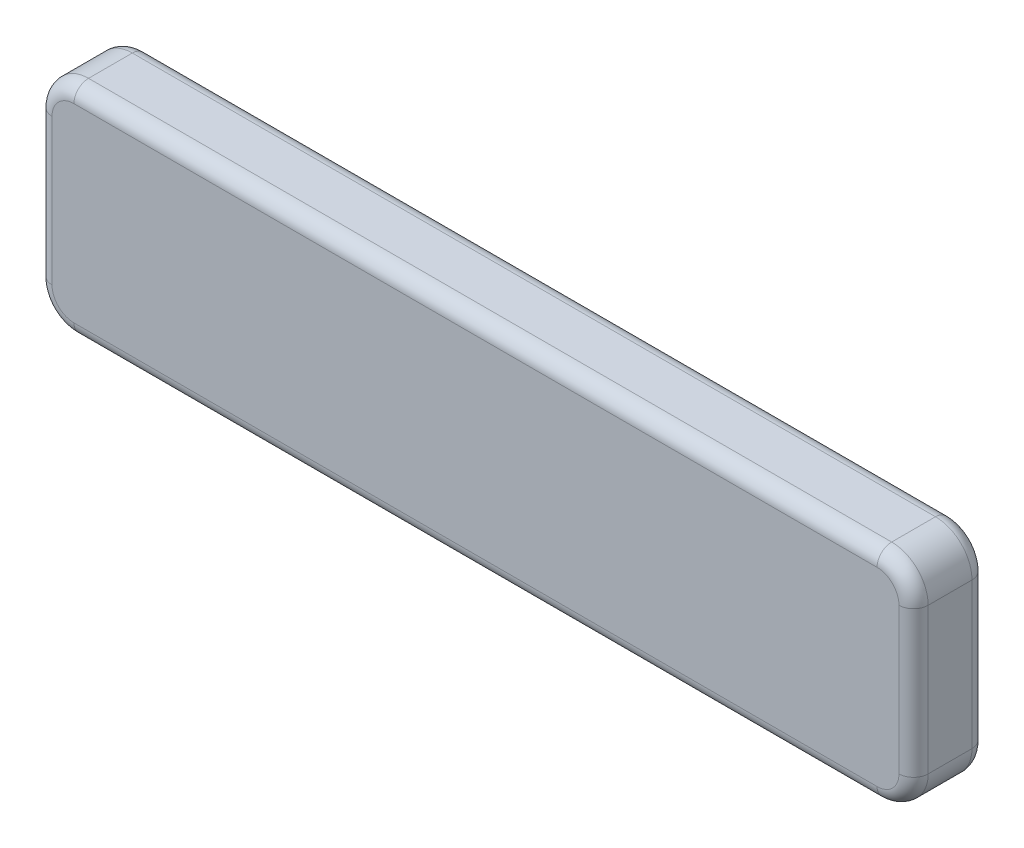
ISO-10303-21;
HEADER;
FILE_DESCRIPTION(('STEP AP214'),'2;1');
FILE_NAME('part.step','',(''),(''),'','','');
FILE_SCHEMA(('AUTOMOTIVE_DESIGN { 1 0 10303 214 1 1 1 1 }'));
ENDSEC;
DATA;
#1=APPLICATION_CONTEXT('core data for automotive mechanical design processes');
#2=APPLICATION_PROTOCOL_DEFINITION('international standard','automotive_design',2000,#1);
#3=PRODUCT_CONTEXT('',#1,'mechanical');
#4=PRODUCT('Part','Part','',(#3));
#5=PRODUCT_RELATED_PRODUCT_CATEGORY('part','',(#4));
#6=PRODUCT_DEFINITION_FORMATION('','',#4);
#7=PRODUCT_DEFINITION_CONTEXT('part definition',#1,'design');
#8=PRODUCT_DEFINITION('design','',#6,#7);
#9=PRODUCT_DEFINITION_SHAPE('','',#8);
#10=(LENGTH_UNIT() NAMED_UNIT(*) SI_UNIT(.MILLI.,.METRE.));
#11=(NAMED_UNIT(*) PLANE_ANGLE_UNIT() SI_UNIT($,.RADIAN.));
#12=(NAMED_UNIT(*) SI_UNIT($,.STERADIAN.) SOLID_ANGLE_UNIT());
#13=UNCERTAINTY_MEASURE_WITH_UNIT(LENGTH_MEASURE(1.E-05),#10,'distance_accuracy_value','');
#14=(GEOMETRIC_REPRESENTATION_CONTEXT(3) GLOBAL_UNCERTAINTY_ASSIGNED_CONTEXT((#13)) GLOBAL_UNIT_ASSIGNED_CONTEXT((#10,
#11,#12)) REPRESENTATION_CONTEXT('',''));
#15=CARTESIAN_POINT('',(0.,0.,0.));
#16=DIRECTION('',(0.,0.,1.));
#17=DIRECTION('',(1.,0.,0.));
#18=AXIS2_PLACEMENT_3D('',#15,#16,#17);
#19=CARTESIAN_POINT('',(-60.,-15.,10.));
#20=DIRECTION('',(1.,0.,0.));
#21=DIRECTION('',(0.,0.,-1.));
#22=AXIS2_PLACEMENT_3D('',#19,#20,#21);
#23=PLANE('',#22);
#24=DIRECTION('',(0.,0.,-1.));
#25=VECTOR('',#24,1.);
#26=CARTESIAN_POINT('',(-60.,9.99999999999998,10.));
#27=LINE('',#26,#25);
#28=CARTESIAN_POINT('',(-60.,9.99999999999998,8.));
#29=VERTEX_POINT('',#28);
#30=CARTESIAN_POINT('',(-60.,9.99999999999998,2.));
#31=VERTEX_POINT('',#30);
#32=EDGE_CURVE('E336',#29,#31,#27,.T.);
#33=ORIENTED_EDGE('',*,*,#32,.T.);
#34=DIRECTION('',(0.,-1.,0.));
#35=VECTOR('',#34,1.);
#36=CARTESIAN_POINT('',(-60.,-15.,2.));
#37=LINE('',#36,#35);
#38=CARTESIAN_POINT('',(-60.,-10.,2.));
#39=VERTEX_POINT('',#38);
#40=EDGE_CURVE('E223',#31,#39,#37,.T.);
#41=ORIENTED_EDGE('',*,*,#40,.T.);
#42=DIRECTION('',(0.,0.,-1.));
#43=VECTOR('',#42,1.);
#44=CARTESIAN_POINT('',(-60.,-10.,10.));
#45=LINE('',#44,#43);
#46=CARTESIAN_POINT('',(-60.,-10.,8.));
#47=VERTEX_POINT('',#46);
#48=EDGE_CURVE('E342',#39,#47,#45,.F.);
#49=ORIENTED_EDGE('',*,*,#48,.T.);
#50=DIRECTION('',(0.,-1.,0.));
#51=VECTOR('',#50,1.);
#52=CARTESIAN_POINT('',(-60.,9.99999999999998,8.));
#53=LINE('',#52,#51);
#54=EDGE_CURVE('E220',#47,#29,#53,.F.);
#55=ORIENTED_EDGE('',*,*,#54,.T.);
#56=EDGE_LOOP('',(#33,#41,#49,#55));
#57=FACE_BOUND('',#56,.T.);
#58=ADVANCED_FACE('F41',(#57),#23,.F.);
#59=CARTESIAN_POINT('',(60.,-15.,10.));
#60=DIRECTION('',(0.,1.,0.));
#61=DIRECTION('',(-1.,0.,0.));
#62=AXIS2_PLACEMENT_3D('',#59,#60,#61);
#63=PLANE('',#62);
#64=DIRECTION('',(0.,0.,-1.));
#65=VECTOR('',#64,1.);
#66=CARTESIAN_POINT('',(-55.,-15.,10.));
#67=LINE('',#66,#65);
#68=CARTESIAN_POINT('',(-55.,-15.,8.));
#69=VERTEX_POINT('',#68);
#70=CARTESIAN_POINT('',(-55.,-15.,2.));
#71=VERTEX_POINT('',#70);
#72=EDGE_CURVE('E333',#69,#71,#67,.T.);
#73=ORIENTED_EDGE('',*,*,#72,.T.);
#74=DIRECTION('',(1.,0.,0.));
#75=VECTOR('',#74,1.);
#76=CARTESIAN_POINT('',(60.,-15.,2.));
#77=LINE('',#76,#75);
#78=CARTESIAN_POINT('',(55.,-15.,2.));
#79=VERTEX_POINT('',#78);
#80=EDGE_CURVE('E235',#71,#79,#77,.T.);
#81=ORIENTED_EDGE('',*,*,#80,.T.);
#82=DIRECTION('',(0.,0.,-1.));
#83=VECTOR('',#82,1.);
#84=CARTESIAN_POINT('',(55.,-15.,10.));
#85=LINE('',#84,#83);
#86=CARTESIAN_POINT('',(55.,-15.,8.));
#87=VERTEX_POINT('',#86);
#88=EDGE_CURVE('E281',#79,#87,#85,.F.);
#89=ORIENTED_EDGE('',*,*,#88,.T.);
#90=DIRECTION('',(1.,0.,0.));
#91=VECTOR('',#90,1.);
#92=CARTESIAN_POINT('',(-55.,-15.,8.));
#93=LINE('',#92,#91);
#94=EDGE_CURVE('E232',#87,#69,#93,.F.);
#95=ORIENTED_EDGE('',*,*,#94,.T.);
#96=EDGE_LOOP('',(#73,#81,#89,#95));
#97=FACE_BOUND('',#96,.T.);
#98=ADVANCED_FACE('F330',(#97),#63,.F.);
#99=CARTESIAN_POINT('',(60.,-15.,10.));
#100=DIRECTION('',(-1.,0.,0.));
#101=DIRECTION('',(0.,0.,1.));
#102=AXIS2_PLACEMENT_3D('',#99,#100,#101);
#103=PLANE('',#102);
#104=DIRECTION('',(0.,0.,-1.));
#105=VECTOR('',#104,1.);
#106=CARTESIAN_POINT('',(60.,-10.,10.));
#107=LINE('',#106,#105);
#108=CARTESIAN_POINT('',(60.,-10.,8.));
#109=VERTEX_POINT('',#108);
#110=CARTESIAN_POINT('',(60.,-10.,2.));
#111=VERTEX_POINT('',#110);
#112=EDGE_CURVE('E327',#109,#111,#107,.T.);
#113=ORIENTED_EDGE('',*,*,#112,.T.);
#114=DIRECTION('',(0.,1.,0.));
#115=VECTOR('',#114,1.);
#116=CARTESIAN_POINT('',(60.,-15.,2.));
#117=LINE('',#116,#115);
#118=CARTESIAN_POINT('',(60.,10.,2.));
#119=VERTEX_POINT('',#118);
#120=EDGE_CURVE('E198',#111,#119,#117,.T.);
#121=ORIENTED_EDGE('',*,*,#120,.T.);
#122=DIRECTION('',(0.,0.,-1.));
#123=VECTOR('',#122,1.);
#124=CARTESIAN_POINT('',(60.,10.,10.));
#125=LINE('',#124,#123);
#126=CARTESIAN_POINT('',(60.,10.,8.));
#127=VERTEX_POINT('',#126);
#128=EDGE_CURVE('E346',#119,#127,#125,.F.);
#129=ORIENTED_EDGE('',*,*,#128,.T.);
#130=DIRECTION('',(0.,1.,0.));
#131=VECTOR('',#130,1.);
#132=CARTESIAN_POINT('',(60.,-10.,8.));
#133=LINE('',#132,#131);
#134=EDGE_CURVE('E195',#127,#109,#133,.F.);
#135=ORIENTED_EDGE('',*,*,#134,.T.);
#136=EDGE_LOOP('',(#113,#121,#129,#135));
#137=FACE_BOUND('',#136,.T.);
#138=ADVANCED_FACE('F382',(#137),#103,.F.);
#139=CARTESIAN_POINT('',(60.,15.,10.));
#140=DIRECTION('',(0.,-1.,0.));
#141=DIRECTION('',(1.,0.,0.));
#142=AXIS2_PLACEMENT_3D('',#139,#140,#141);
#143=PLANE('',#142);
#144=DIRECTION('',(0.,0.,-1.));
#145=VECTOR('',#144,1.);
#146=CARTESIAN_POINT('',(55.,15.,10.));
#147=LINE('',#146,#145);
#148=CARTESIAN_POINT('',(55.,15.,8.));
#149=VERTEX_POINT('',#148);
#150=CARTESIAN_POINT('',(55.,15.,2.));
#151=VERTEX_POINT('',#150);
#152=EDGE_CURVE('E177',#149,#151,#147,.T.);
#153=ORIENTED_EDGE('',*,*,#152,.T.);
#154=DIRECTION('',(-1.,0.,0.));
#155=VECTOR('',#154,1.);
#156=CARTESIAN_POINT('',(60.,15.,2.));
#157=LINE('',#156,#155);
#158=CARTESIAN_POINT('',(-55.,15.,2.));
#159=VERTEX_POINT('',#158);
#160=EDGE_CURVE('E210',#151,#159,#157,.T.);
#161=ORIENTED_EDGE('',*,*,#160,.T.);
#162=DIRECTION('',(0.,0.,-1.));
#163=VECTOR('',#162,1.);
#164=CARTESIAN_POINT('',(-55.,15.,10.));
#165=LINE('',#164,#163);
#166=CARTESIAN_POINT('',(-55.,15.,8.));
#167=VERTEX_POINT('',#166);
#168=EDGE_CURVE('E352',#159,#167,#165,.F.);
#169=ORIENTED_EDGE('',*,*,#168,.T.);
#170=DIRECTION('',(-1.,0.,0.));
#171=VECTOR('',#170,1.);
#172=CARTESIAN_POINT('',(55.,15.,8.));
#173=LINE('',#172,#171);
#174=EDGE_CURVE('E207',#167,#149,#173,.F.);
#175=ORIENTED_EDGE('',*,*,#174,.T.);
#176=EDGE_LOOP('',(#153,#161,#169,#175));
#177=FACE_BOUND('',#176,.T.);
#178=ADVANCED_FACE('F425',(#177),#143,.F.);
#179=CARTESIAN_POINT('',(0.,0.,10.));
#180=DIRECTION('',(0.,0.,1.));
#181=DIRECTION('',(1.,0.,0.));
#182=AXIS2_PLACEMENT_3D('',#179,#180,#181);
#183=PLANE('',#182);
#184=DIRECTION('',(-1.,0.,0.));
#185=VECTOR('',#184,1.);
#186=CARTESIAN_POINT('',(-55.,13.,10.));
#187=LINE('',#186,#185);
#188=CARTESIAN_POINT('',(55.,13.,10.));
#189=VERTEX_POINT('',#188);
#190=CARTESIAN_POINT('',(-55.,13.,10.));
#191=VERTEX_POINT('',#190);
#192=EDGE_CURVE('E51',#189,#191,#187,.T.);
#193=ORIENTED_EDGE('',*,*,#192,.T.);
#194=CARTESIAN_POINT('',(-55.,9.99999999999998,10.));
#195=DIRECTION('',(0.,0.,1.));
#196=DIRECTION('',(1.,0.,0.));
#197=AXIS2_PLACEMENT_3D('',#194,#195,#196);
#198=CIRCLE('',#197,3.);
#199=CARTESIAN_POINT('',(-58.,9.99999999999998,10.));
#200=VERTEX_POINT('',#199);
#201=EDGE_CURVE('E11',#191,#200,#198,.T.);
#202=ORIENTED_EDGE('',*,*,#201,.T.);
#203=DIRECTION('',(0.,-1.,0.));
#204=VECTOR('',#203,1.);
#205=CARTESIAN_POINT('',(-58.,-10.,10.));
#206=LINE('',#205,#204);
#207=CARTESIAN_POINT('',(-58.,-10.,10.));
#208=VERTEX_POINT('',#207);
#209=EDGE_CURVE('E238',#200,#208,#206,.T.);
#210=ORIENTED_EDGE('',*,*,#209,.T.);
#211=CARTESIAN_POINT('',(-55.,-10.,10.));
#212=DIRECTION('',(0.,0.,1.));
#213=DIRECTION('',(1.,0.,0.));
#214=AXIS2_PLACEMENT_3D('',#211,#212,#213);
#215=CIRCLE('',#214,3.);
#216=CARTESIAN_POINT('',(-55.,-13.,10.));
#217=VERTEX_POINT('',#216);
#218=EDGE_CURVE('E241',#208,#217,#215,.T.);
#219=ORIENTED_EDGE('',*,*,#218,.T.);
#220=DIRECTION('',(1.,0.,0.));
#221=VECTOR('',#220,1.);
#222=CARTESIAN_POINT('',(55.,-13.,10.));
#223=LINE('',#222,#221);
#224=CARTESIAN_POINT('',(55.,-13.,10.));
#225=VERTEX_POINT('',#224);
#226=EDGE_CURVE('E244',#217,#225,#223,.T.);
#227=ORIENTED_EDGE('',*,*,#226,.T.);
#228=CARTESIAN_POINT('',(55.,-10.,10.));
#229=DIRECTION('',(0.,0.,1.));
#230=DIRECTION('',(1.,0.,0.));
#231=AXIS2_PLACEMENT_3D('',#228,#229,#230);
#232=CIRCLE('',#231,3.);
#233=CARTESIAN_POINT('',(58.,-10.,10.));
#234=VERTEX_POINT('',#233);
#235=EDGE_CURVE('E247',#225,#234,#232,.T.);
#236=ORIENTED_EDGE('',*,*,#235,.T.);
#237=DIRECTION('',(0.,1.,0.));
#238=VECTOR('',#237,1.);
#239=CARTESIAN_POINT('',(58.,10.,10.));
#240=LINE('',#239,#238);
#241=CARTESIAN_POINT('',(58.,10.,10.));
#242=VERTEX_POINT('',#241);
#243=EDGE_CURVE('E250',#234,#242,#240,.T.);
#244=ORIENTED_EDGE('',*,*,#243,.T.);
#245=CARTESIAN_POINT('',(55.,10.,10.));
#246=DIRECTION('',(0.,0.,1.));
#247=DIRECTION('',(1.,0.,0.));
#248=AXIS2_PLACEMENT_3D('',#245,#246,#247);
#249=CIRCLE('',#248,3.);
#250=EDGE_CURVE('E62',#242,#189,#249,.T.);
#251=ORIENTED_EDGE('',*,*,#250,.T.);
#252=EDGE_LOOP('',(#193,#202,#210,#219,#227,#236,#244,#251));
#253=FACE_BOUND('',#252,.T.);
#254=ADVANCED_FACE('F398',(#253),#183,.T.);
#255=CARTESIAN_POINT('',(0.,0.,0.));
#256=DIRECTION('',(0.,0.,1.));
#257=DIRECTION('',(1.,0.,0.));
#258=AXIS2_PLACEMENT_3D('',#255,#256,#257);
#259=PLANE('',#258);
#260=DIRECTION('',(0.,1.,0.));
#261=VECTOR('',#260,1.);
#262=CARTESIAN_POINT('',(58.,0.,0.));
#263=LINE('',#262,#261);
#264=CARTESIAN_POINT('',(58.,10.,0.));
#265=VERTEX_POINT('',#264);
#266=CARTESIAN_POINT('',(58.,-10.,0.));
#267=VERTEX_POINT('',#266);
#268=EDGE_CURVE('E181',#265,#267,#263,.F.);
#269=ORIENTED_EDGE('',*,*,#268,.T.);
#270=CARTESIAN_POINT('',(55.,-10.,0.));
#271=DIRECTION('',(0.,0.,1.));
#272=DIRECTION('',(1.,0.,0.));
#273=AXIS2_PLACEMENT_3D('',#270,#271,#272);
#274=CIRCLE('',#273,3.);
#275=CARTESIAN_POINT('',(55.,-13.,0.));
#276=VERTEX_POINT('',#275);
#277=EDGE_CURVE('E160',#267,#276,#274,.F.);
#278=ORIENTED_EDGE('',*,*,#277,.T.);
#279=DIRECTION('',(1.,0.,0.));
#280=VECTOR('',#279,1.);
#281=CARTESIAN_POINT('',(0.,-13.,0.));
#282=LINE('',#281,#280);
#283=CARTESIAN_POINT('',(-55.,-13.,0.));
#284=VERTEX_POINT('',#283);
#285=EDGE_CURVE('E169',#276,#284,#282,.F.);
#286=ORIENTED_EDGE('',*,*,#285,.T.);
#287=CARTESIAN_POINT('',(-55.,-10.,0.));
#288=DIRECTION('',(0.,0.,1.));
#289=DIRECTION('',(1.,0.,0.));
#290=AXIS2_PLACEMENT_3D('',#287,#288,#289);
#291=CIRCLE('',#290,3.);
#292=CARTESIAN_POINT('',(-58.,-10.,0.));
#293=VERTEX_POINT('',#292);
#294=EDGE_CURVE('E176',#284,#293,#291,.F.);
#295=ORIENTED_EDGE('',*,*,#294,.T.);
#296=DIRECTION('',(0.,-1.,0.));
#297=VECTOR('',#296,1.);
#298=CARTESIAN_POINT('',(-58.,0.,0.));
#299=LINE('',#298,#297);
#300=CARTESIAN_POINT('',(-58.,9.99999999999998,0.));
#301=VERTEX_POINT('',#300);
#302=EDGE_CURVE('E361',#293,#301,#299,.F.);
#303=ORIENTED_EDGE('',*,*,#302,.T.);
#304=CARTESIAN_POINT('',(-55.,9.99999999999998,0.));
#305=DIRECTION('',(0.,0.,1.));
#306=DIRECTION('',(1.,0.,0.));
#307=AXIS2_PLACEMENT_3D('',#304,#305,#306);
#308=CIRCLE('',#307,3.);
#309=CARTESIAN_POINT('',(-55.,13.,0.));
#310=VERTEX_POINT('',#309);
#311=EDGE_CURVE('E364',#301,#310,#308,.F.);
#312=ORIENTED_EDGE('',*,*,#311,.T.);
#313=DIRECTION('',(-1.,0.,0.));
#314=VECTOR('',#313,1.);
#315=CARTESIAN_POINT('',(0.,13.,0.));
#316=LINE('',#315,#314);
#317=CARTESIAN_POINT('',(55.,13.,0.));
#318=VERTEX_POINT('',#317);
#319=EDGE_CURVE('E367',#310,#318,#316,.F.);
#320=ORIENTED_EDGE('',*,*,#319,.T.);
#321=CARTESIAN_POINT('',(55.,10.,0.));
#322=DIRECTION('',(0.,0.,1.));
#323=DIRECTION('',(1.,0.,0.));
#324=AXIS2_PLACEMENT_3D('',#321,#322,#323);
#325=CIRCLE('',#324,3.);
#326=EDGE_CURVE('E189',#318,#265,#325,.F.);
#327=ORIENTED_EDGE('',*,*,#326,.T.);
#328=EDGE_LOOP('',(#269,#278,#286,#295,#303,#312,#320,#327));
#329=FACE_BOUND('',#328,.T.);
#330=ADVANCED_FACE('F179',(#329),#259,.F.);
#331=CARTESIAN_POINT('',(-55.,-10.,10.));
#332=DIRECTION('',(0.,0.,-1.));
#333=DIRECTION('',(-1.,0.,0.));
#334=AXIS2_PLACEMENT_3D('',#331,#332,#333);
#335=CYLINDRICAL_SURFACE('',#334,5.);
#336=ORIENTED_EDGE('',*,*,#48,.F.);
#337=CARTESIAN_POINT('',(-55.,-10.,2.));
#338=DIRECTION('',(0.,0.,1.));
#339=DIRECTION('',(1.,0.,0.));
#340=AXIS2_PLACEMENT_3D('',#337,#338,#339);
#341=CIRCLE('',#340,5.);
#342=EDGE_CURVE('E229',#39,#71,#341,.T.);
#343=ORIENTED_EDGE('',*,*,#342,.T.);
#344=ORIENTED_EDGE('',*,*,#72,.F.);
#345=CARTESIAN_POINT('',(-55.,-10.,8.));
#346=DIRECTION('',(0.,0.,1.));
#347=DIRECTION('',(1.,0.,0.));
#348=AXIS2_PLACEMENT_3D('',#345,#346,#347);
#349=CIRCLE('',#348,5.);
#350=EDGE_CURVE('E226',#69,#47,#349,.F.);
#351=ORIENTED_EDGE('',*,*,#350,.T.);
#352=EDGE_LOOP('',(#336,#343,#344,#351));
#353=FACE_BOUND('',#352,.T.);
#354=ADVANCED_FACE('F442',(#353),#335,.T.);
#355=CARTESIAN_POINT('',(55.,-10.,10.));
#356=DIRECTION('',(0.,0.,-1.));
#357=DIRECTION('',(-1.,0.,0.));
#358=AXIS2_PLACEMENT_3D('',#355,#356,#357);
#359=CYLINDRICAL_SURFACE('',#358,5.);
#360=ORIENTED_EDGE('',*,*,#88,.F.);
#361=CARTESIAN_POINT('',(55.,-10.,2.));
#362=DIRECTION('',(0.,0.,1.));
#363=DIRECTION('',(1.,0.,0.));
#364=AXIS2_PLACEMENT_3D('',#361,#362,#363);
#365=CIRCLE('',#364,5.);
#366=EDGE_CURVE('E162',#79,#111,#365,.T.);
#367=ORIENTED_EDGE('',*,*,#366,.T.);
#368=ORIENTED_EDGE('',*,*,#112,.F.);
#369=CARTESIAN_POINT('',(55.,-10.,8.));
#370=DIRECTION('',(0.,0.,1.));
#371=DIRECTION('',(1.,0.,0.));
#372=AXIS2_PLACEMENT_3D('',#369,#370,#371);
#373=CIRCLE('',#372,5.);
#374=EDGE_CURVE('E184',#109,#87,#373,.F.);
#375=ORIENTED_EDGE('',*,*,#374,.T.);
#376=EDGE_LOOP('',(#360,#367,#368,#375));
#377=FACE_BOUND('',#376,.T.);
#378=ADVANCED_FACE('F325',(#377),#359,.T.);
#379=CARTESIAN_POINT('',(55.,10.,10.));
#380=DIRECTION('',(0.,0.,-1.));
#381=DIRECTION('',(-1.,0.,0.));
#382=AXIS2_PLACEMENT_3D('',#379,#380,#381);
#383=CYLINDRICAL_SURFACE('',#382,5.);
#384=ORIENTED_EDGE('',*,*,#128,.F.);
#385=CARTESIAN_POINT('',(55.,10.,2.));
#386=DIRECTION('',(0.,0.,1.));
#387=DIRECTION('',(1.,0.,0.));
#388=AXIS2_PLACEMENT_3D('',#385,#386,#387);
#389=CIRCLE('',#388,5.);
#390=EDGE_CURVE('E204',#119,#151,#389,.T.);
#391=ORIENTED_EDGE('',*,*,#390,.T.);
#392=ORIENTED_EDGE('',*,*,#152,.F.);
#393=CARTESIAN_POINT('',(55.,10.,8.));
#394=DIRECTION('',(0.,0.,1.));
#395=DIRECTION('',(1.,0.,0.));
#396=AXIS2_PLACEMENT_3D('',#393,#394,#395);
#397=CIRCLE('',#396,5.);
#398=EDGE_CURVE('E201',#149,#127,#397,.F.);
#399=ORIENTED_EDGE('',*,*,#398,.T.);
#400=EDGE_LOOP('',(#384,#391,#392,#399));
#401=FACE_BOUND('',#400,.T.);
#402=ADVANCED_FACE('F384',(#401),#383,.T.);
#403=CARTESIAN_POINT('',(-55.,9.99999999999998,10.));
#404=DIRECTION('',(0.,0.,-1.));
#405=DIRECTION('',(-1.,0.,0.));
#406=AXIS2_PLACEMENT_3D('',#403,#404,#405);
#407=CYLINDRICAL_SURFACE('',#406,5.);
#408=ORIENTED_EDGE('',*,*,#168,.F.);
#409=CARTESIAN_POINT('',(-55.,9.99999999999998,2.));
#410=DIRECTION('',(0.,0.,1.));
#411=DIRECTION('',(1.,0.,0.));
#412=AXIS2_PLACEMENT_3D('',#409,#410,#411);
#413=CIRCLE('',#412,5.);
#414=EDGE_CURVE('E217',#159,#31,#413,.T.);
#415=ORIENTED_EDGE('',*,*,#414,.T.);
#416=ORIENTED_EDGE('',*,*,#32,.F.);
#417=CARTESIAN_POINT('',(-55.,9.99999999999998,8.));
#418=DIRECTION('',(0.,0.,1.));
#419=DIRECTION('',(1.,0.,0.));
#420=AXIS2_PLACEMENT_3D('',#417,#418,#419);
#421=CIRCLE('',#420,5.);
#422=EDGE_CURVE('E213',#29,#167,#421,.F.);
#423=ORIENTED_EDGE('',*,*,#422,.T.);
#424=EDGE_LOOP('',(#408,#415,#416,#423));
#425=FACE_BOUND('',#424,.T.);
#426=ADVANCED_FACE('F414',(#425),#407,.T.);
#427=CARTESIAN_POINT('',(-55.,9.99999999999998,2.));
#428=DIRECTION('',(0.,0.,1.));
#429=DIRECTION('',(1.,0.,0.));
#430=AXIS2_PLACEMENT_3D('',#427,#428,#429);
#431=TOROIDAL_SURFACE('',#430,3.,2.);
#432=CARTESIAN_POINT('',(-58.,9.99999999999998,2.));
#433=DIRECTION('',(0.,-1.,0.));
#434=DIRECTION('',(0.,0.,-1.));
#435=AXIS2_PLACEMENT_3D('',#432,#433,#434);
#436=CIRCLE('',#435,2.);
#437=EDGE_CURVE('E273',#31,#301,#436,.T.);
#438=ORIENTED_EDGE('',*,*,#437,.F.);
#439=ORIENTED_EDGE('',*,*,#414,.F.);
#440=CARTESIAN_POINT('',(-55.,13.,2.));
#441=DIRECTION('',(1.,0.,0.));
#442=DIRECTION('',(0.,0.,-1.));
#443=AXIS2_PLACEMENT_3D('',#440,#441,#442);
#444=CIRCLE('',#443,2.);
#445=EDGE_CURVE('E277',#310,#159,#444,.T.);
#446=ORIENTED_EDGE('',*,*,#445,.F.);
#447=ORIENTED_EDGE('',*,*,#311,.F.);
#448=EDGE_LOOP('',(#438,#439,#446,#447));
#449=FACE_BOUND('',#448,.T.);
#450=ADVANCED_FACE('F418',(#449),#431,.T.);
#451=CARTESIAN_POINT('',(60.,13.,2.));
#452=DIRECTION('',(-1.,0.,0.));
#453=DIRECTION('',(0.,-1.,0.));
#454=AXIS2_PLACEMENT_3D('',#451,#452,#453);
#455=CYLINDRICAL_SURFACE('',#454,2.);
#456=ORIENTED_EDGE('',*,*,#445,.T.);
#457=ORIENTED_EDGE('',*,*,#160,.F.);
#458=CARTESIAN_POINT('',(55.,13.,2.));
#459=DIRECTION('',(1.,0.,0.));
#460=DIRECTION('',(0.,0.,-1.));
#461=AXIS2_PLACEMENT_3D('',#458,#459,#460);
#462=CIRCLE('',#461,2.);
#463=EDGE_CURVE('E269',#318,#151,#462,.T.);
#464=ORIENTED_EDGE('',*,*,#463,.F.);
#465=ORIENTED_EDGE('',*,*,#319,.F.);
#466=EDGE_LOOP('',(#456,#457,#464,#465));
#467=FACE_BOUND('',#466,.T.);
#468=ADVANCED_FACE('F423',(#467),#455,.T.);
#469=CARTESIAN_POINT('',(-58.,-15.,2.));
#470=DIRECTION('',(0.,-1.,0.));
#471=DIRECTION('',(0.,0.,-1.));
#472=AXIS2_PLACEMENT_3D('',#469,#470,#471);
#473=CYLINDRICAL_SURFACE('',#472,2.);
#474=ORIENTED_EDGE('',*,*,#437,.T.);
#475=ORIENTED_EDGE('',*,*,#302,.F.);
#476=CARTESIAN_POINT('',(-58.,-10.,2.));
#477=DIRECTION('',(0.,-1.,0.));
#478=DIRECTION('',(0.,0.,-1.));
#479=AXIS2_PLACEMENT_3D('',#476,#477,#478);
#480=CIRCLE('',#479,2.);
#481=EDGE_CURVE('E265',#39,#293,#480,.T.);
#482=ORIENTED_EDGE('',*,*,#481,.F.);
#483=ORIENTED_EDGE('',*,*,#40,.F.);
#484=EDGE_LOOP('',(#474,#475,#482,#483));
#485=FACE_BOUND('',#484,.T.);
#486=ADVANCED_FACE('F464',(#485),#473,.T.);
#487=CARTESIAN_POINT('',(55.,10.,2.));
#488=DIRECTION('',(0.,0.,1.));
#489=DIRECTION('',(1.,0.,0.));
#490=AXIS2_PLACEMENT_3D('',#487,#488,#489);
#491=TOROIDAL_SURFACE('',#490,3.,2.);
#492=ORIENTED_EDGE('',*,*,#463,.T.);
#493=ORIENTED_EDGE('',*,*,#390,.F.);
#494=CARTESIAN_POINT('',(58.,10.,2.));
#495=DIRECTION('',(0.,-1.,0.));
#496=DIRECTION('',(0.,0.,-1.));
#497=AXIS2_PLACEMENT_3D('',#494,#495,#496);
#498=CIRCLE('',#497,2.);
#499=EDGE_CURVE('E261',#265,#119,#498,.T.);
#500=ORIENTED_EDGE('',*,*,#499,.F.);
#501=ORIENTED_EDGE('',*,*,#326,.F.);
#502=EDGE_LOOP('',(#492,#493,#500,#501));
#503=FACE_BOUND('',#502,.T.);
#504=ADVANCED_FACE('F376',(#503),#491,.T.);
#505=CARTESIAN_POINT('',(-55.,-10.,2.));
#506=DIRECTION('',(0.,0.,1.));
#507=DIRECTION('',(1.,0.,0.));
#508=AXIS2_PLACEMENT_3D('',#505,#506,#507);
#509=TOROIDAL_SURFACE('',#508,3.,2.);
#510=ORIENTED_EDGE('',*,*,#481,.T.);
#511=ORIENTED_EDGE('',*,*,#294,.F.);
#512=CARTESIAN_POINT('',(-55.,-13.,2.));
#513=DIRECTION('',(1.,0.,0.));
#514=DIRECTION('',(0.,0.,-1.));
#515=AXIS2_PLACEMENT_3D('',#512,#513,#514);
#516=CIRCLE('',#515,2.);
#517=EDGE_CURVE('E172',#71,#284,#516,.T.);
#518=ORIENTED_EDGE('',*,*,#517,.F.);
#519=ORIENTED_EDGE('',*,*,#342,.F.);
#520=EDGE_LOOP('',(#510,#511,#518,#519));
#521=FACE_BOUND('',#520,.T.);
#522=ADVANCED_FACE('F458',(#521),#509,.T.);
#523=CARTESIAN_POINT('',(58.,-15.,2.));
#524=DIRECTION('',(0.,1.,0.));
#525=DIRECTION('',(0.,0.,1.));
#526=AXIS2_PLACEMENT_3D('',#523,#524,#525);
#527=CYLINDRICAL_SURFACE('',#526,2.);
#528=ORIENTED_EDGE('',*,*,#499,.T.);
#529=ORIENTED_EDGE('',*,*,#120,.F.);
#530=CARTESIAN_POINT('',(58.,-10.,2.));
#531=DIRECTION('',(0.,-1.,0.));
#532=DIRECTION('',(0.,0.,-1.));
#533=AXIS2_PLACEMENT_3D('',#530,#531,#532);
#534=CIRCLE('',#533,2.);
#535=EDGE_CURVE('E166',#267,#111,#534,.T.);
#536=ORIENTED_EDGE('',*,*,#535,.F.);
#537=ORIENTED_EDGE('',*,*,#268,.F.);
#538=EDGE_LOOP('',(#528,#529,#536,#537));
#539=FACE_BOUND('',#538,.T.);
#540=ADVANCED_FACE('F379',(#539),#527,.T.);
#541=CARTESIAN_POINT('',(60.,-13.,2.));
#542=DIRECTION('',(1.,0.,0.));
#543=DIRECTION('',(0.,1.,0.));
#544=AXIS2_PLACEMENT_3D('',#541,#542,#543);
#545=CYLINDRICAL_SURFACE('',#544,2.);
#546=ORIENTED_EDGE('',*,*,#517,.T.);
#547=ORIENTED_EDGE('',*,*,#285,.F.);
#548=CARTESIAN_POINT('',(55.,-13.,2.));
#549=DIRECTION('',(1.,0.,0.));
#550=DIRECTION('',(0.,0.,-1.));
#551=AXIS2_PLACEMENT_3D('',#548,#549,#550);
#552=CIRCLE('',#551,2.);
#553=EDGE_CURVE('E156',#79,#276,#552,.T.);
#554=ORIENTED_EDGE('',*,*,#553,.F.);
#555=ORIENTED_EDGE('',*,*,#80,.F.);
#556=EDGE_LOOP('',(#546,#547,#554,#555));
#557=FACE_BOUND('',#556,.T.);
#558=ADVANCED_FACE('F170',(#557),#545,.T.);
#559=CARTESIAN_POINT('',(55.,-10.,2.));
#560=DIRECTION('',(0.,0.,1.));
#561=DIRECTION('',(1.,0.,0.));
#562=AXIS2_PLACEMENT_3D('',#559,#560,#561);
#563=TOROIDAL_SURFACE('',#562,3.,2.);
#564=ORIENTED_EDGE('',*,*,#535,.T.);
#565=ORIENTED_EDGE('',*,*,#366,.F.);
#566=ORIENTED_EDGE('',*,*,#553,.T.);
#567=ORIENTED_EDGE('',*,*,#277,.F.);
#568=EDGE_LOOP('',(#564,#565,#566,#567));
#569=FACE_BOUND('',#568,.T.);
#570=ADVANCED_FACE('F158',(#569),#563,.T.);
#571=CARTESIAN_POINT('',(55.,-10.,8.));
#572=DIRECTION('',(0.,0.,1.));
#573=DIRECTION('',(1.,0.,0.));
#574=AXIS2_PLACEMENT_3D('',#571,#572,#573);
#575=TOROIDAL_SURFACE('',#574,3.,2.);
#576=CARTESIAN_POINT('',(55.,-13.,8.));
#577=DIRECTION('',(-1.,0.,0.));
#578=DIRECTION('',(0.,0.,1.));
#579=AXIS2_PLACEMENT_3D('',#576,#577,#578);
#580=CIRCLE('',#579,2.);
#581=EDGE_CURVE('E303',#87,#225,#580,.T.);
#582=ORIENTED_EDGE('',*,*,#581,.F.);
#583=ORIENTED_EDGE('',*,*,#374,.F.);
#584=CARTESIAN_POINT('',(58.,-10.,8.));
#585=DIRECTION('',(0.,1.,0.));
#586=DIRECTION('',(0.,0.,1.));
#587=AXIS2_PLACEMENT_3D('',#584,#585,#586);
#588=CIRCLE('',#587,2.);
#589=EDGE_CURVE('E45',#234,#109,#588,.T.);
#590=ORIENTED_EDGE('',*,*,#589,.F.);
#591=ORIENTED_EDGE('',*,*,#235,.F.);
#592=EDGE_LOOP('',(#582,#583,#590,#591));
#593=FACE_BOUND('',#592,.T.);
#594=ADVANCED_FACE('F43',(#593),#575,.T.);
#595=CARTESIAN_POINT('',(58.,0.,8.));
#596=DIRECTION('',(0.,-1.,0.));
#597=DIRECTION('',(0.,0.,-1.));
#598=AXIS2_PLACEMENT_3D('',#595,#596,#597);
#599=CYLINDRICAL_SURFACE('',#598,2.);
#600=ORIENTED_EDGE('',*,*,#589,.T.);
#601=ORIENTED_EDGE('',*,*,#134,.F.);
#602=CARTESIAN_POINT('',(58.,10.,8.));
#603=DIRECTION('',(0.,1.,0.));
#604=DIRECTION('',(0.,0.,1.));
#605=AXIS2_PLACEMENT_3D('',#602,#603,#604);
#606=CIRCLE('',#605,2.);
#607=EDGE_CURVE('E300',#242,#127,#606,.T.);
#608=ORIENTED_EDGE('',*,*,#607,.F.);
#609=ORIENTED_EDGE('',*,*,#243,.F.);
#610=EDGE_LOOP('',(#600,#601,#608,#609));
#611=FACE_BOUND('',#610,.T.);
#612=ADVANCED_FACE('F316',(#611),#599,.T.);
#613=CARTESIAN_POINT('',(0.,-13.,8.));
#614=DIRECTION('',(-1.,0.,0.));
#615=DIRECTION('',(0.,-1.,0.));
#616=AXIS2_PLACEMENT_3D('',#613,#614,#615);
#617=CYLINDRICAL_SURFACE('',#616,2.);
#618=ORIENTED_EDGE('',*,*,#581,.T.);
#619=ORIENTED_EDGE('',*,*,#226,.F.);
#620=CARTESIAN_POINT('',(-55.,-13.,8.));
#621=DIRECTION('',(-1.,0.,0.));
#622=DIRECTION('',(0.,0.,1.));
#623=AXIS2_PLACEMENT_3D('',#620,#621,#622);
#624=CIRCLE('',#623,2.);
#625=EDGE_CURVE('E296',#69,#217,#624,.T.);
#626=ORIENTED_EDGE('',*,*,#625,.F.);
#627=ORIENTED_EDGE('',*,*,#94,.F.);
#628=EDGE_LOOP('',(#618,#619,#626,#627));
#629=FACE_BOUND('',#628,.T.);
#630=ADVANCED_FACE('F482',(#629),#617,.T.);
#631=CARTESIAN_POINT('',(55.,10.,8.));
#632=DIRECTION('',(0.,0.,1.));
#633=DIRECTION('',(1.,0.,0.));
#634=AXIS2_PLACEMENT_3D('',#631,#632,#633);
#635=TOROIDAL_SURFACE('',#634,3.,2.);
#636=ORIENTED_EDGE('',*,*,#607,.T.);
#637=ORIENTED_EDGE('',*,*,#398,.F.);
#638=CARTESIAN_POINT('',(55.,13.,8.));
#639=DIRECTION('',(-1.,0.,0.));
#640=DIRECTION('',(0.,0.,1.));
#641=AXIS2_PLACEMENT_3D('',#638,#639,#640);
#642=CIRCLE('',#641,2.);
#643=EDGE_CURVE('E292',#189,#149,#642,.T.);
#644=ORIENTED_EDGE('',*,*,#643,.F.);
#645=ORIENTED_EDGE('',*,*,#250,.F.);
#646=EDGE_LOOP('',(#636,#637,#644,#645));
#647=FACE_BOUND('',#646,.T.);
#648=ADVANCED_FACE('F388',(#647),#635,.T.);
#649=CARTESIAN_POINT('',(-55.,-10.,8.));
#650=DIRECTION('',(0.,0.,1.));
#651=DIRECTION('',(1.,0.,0.));
#652=AXIS2_PLACEMENT_3D('',#649,#650,#651);
#653=TOROIDAL_SURFACE('',#652,3.,2.);
#654=ORIENTED_EDGE('',*,*,#625,.T.);
#655=ORIENTED_EDGE('',*,*,#218,.F.);
#656=CARTESIAN_POINT('',(-58.,-10.,8.));
#657=DIRECTION('',(0.,1.,0.));
#658=DIRECTION('',(0.,0.,1.));
#659=AXIS2_PLACEMENT_3D('',#656,#657,#658);
#660=CIRCLE('',#659,2.);
#661=EDGE_CURVE('E288',#47,#208,#660,.T.);
#662=ORIENTED_EDGE('',*,*,#661,.F.);
#663=ORIENTED_EDGE('',*,*,#350,.F.);
#664=EDGE_LOOP('',(#654,#655,#662,#663));
#665=FACE_BOUND('',#664,.T.);
#666=ADVANCED_FACE('F403',(#665),#653,.T.);
#667=CARTESIAN_POINT('',(0.,13.,8.));
#668=DIRECTION('',(1.,0.,0.));
#669=DIRECTION('',(0.,1.,0.));
#670=AXIS2_PLACEMENT_3D('',#667,#668,#669);
#671=CYLINDRICAL_SURFACE('',#670,2.);
#672=ORIENTED_EDGE('',*,*,#643,.T.);
#673=ORIENTED_EDGE('',*,*,#174,.F.);
#674=CARTESIAN_POINT('',(-55.,13.,8.));
#675=DIRECTION('',(-1.,0.,0.));
#676=DIRECTION('',(0.,0.,1.));
#677=AXIS2_PLACEMENT_3D('',#674,#675,#676);
#678=CIRCLE('',#677,2.);
#679=EDGE_CURVE('E285',#191,#167,#678,.T.);
#680=ORIENTED_EDGE('',*,*,#679,.F.);
#681=ORIENTED_EDGE('',*,*,#192,.F.);
#682=EDGE_LOOP('',(#672,#673,#680,#681));
#683=FACE_BOUND('',#682,.T.);
#684=ADVANCED_FACE('F391',(#683),#671,.T.);
#685=CARTESIAN_POINT('',(-58.,0.,8.));
#686=DIRECTION('',(0.,1.,0.));
#687=DIRECTION('',(0.,0.,1.));
#688=AXIS2_PLACEMENT_3D('',#685,#686,#687);
#689=CYLINDRICAL_SURFACE('',#688,2.);
#690=ORIENTED_EDGE('',*,*,#661,.T.);
#691=ORIENTED_EDGE('',*,*,#209,.F.);
#692=CARTESIAN_POINT('',(-58.,9.99999999999998,8.));
#693=DIRECTION('',(0.,1.,0.));
#694=DIRECTION('',(0.,0.,1.));
#695=AXIS2_PLACEMENT_3D('',#692,#693,#694);
#696=CIRCLE('',#695,2.);
#697=EDGE_CURVE('E282',#29,#200,#696,.T.);
#698=ORIENTED_EDGE('',*,*,#697,.F.);
#699=ORIENTED_EDGE('',*,*,#54,.F.);
#700=EDGE_LOOP('',(#690,#691,#698,#699));
#701=FACE_BOUND('',#700,.T.);
#702=ADVANCED_FACE('F407',(#701),#689,.T.);
#703=CARTESIAN_POINT('',(-55.,9.99999999999998,8.));
#704=DIRECTION('',(0.,0.,1.));
#705=DIRECTION('',(1.,0.,0.));
#706=AXIS2_PLACEMENT_3D('',#703,#704,#705);
#707=TOROIDAL_SURFACE('',#706,3.,2.);
#708=ORIENTED_EDGE('',*,*,#679,.T.);
#709=ORIENTED_EDGE('',*,*,#422,.F.);
#710=ORIENTED_EDGE('',*,*,#697,.T.);
#711=ORIENTED_EDGE('',*,*,#201,.F.);
#712=EDGE_LOOP('',(#708,#709,#710,#711));
#713=FACE_BOUND('',#712,.T.);
#714=ADVANCED_FACE('F395',(#713),#707,.T.);
#715=CLOSED_SHELL('',(#58,#98,#138,#178,#254,#330,#354,#378,#402,#426,#450,#468,#486,#504,#522,
#540,#558,#570,#594,#612,#630,#648,#666,#684,#702,#714));
#716=MANIFOLD_SOLID_BREP('B2',#715);
#717=ADVANCED_BREP_SHAPE_REPRESENTATION('',(#18,#716),#14);
#718=SHAPE_DEFINITION_REPRESENTATION(#9,#717);
ENDSEC;
END-ISO-10303-21;
